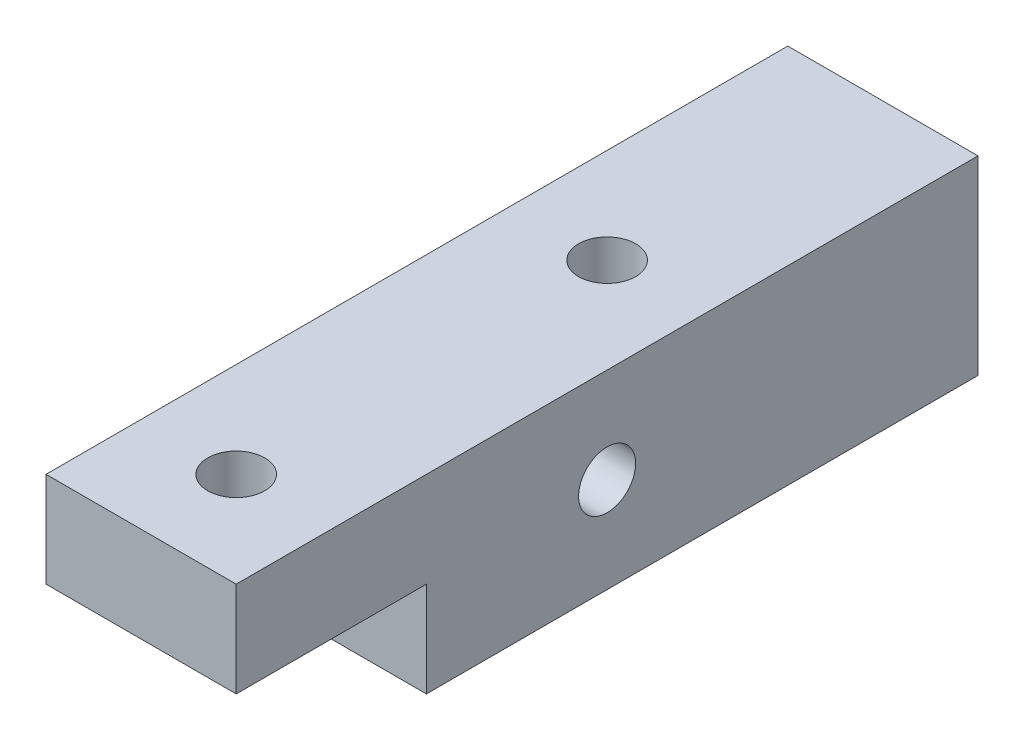
ISO-10303-21;
HEADER;
FILE_DESCRIPTION(('STEP AP214'),'2;1');
FILE_NAME('part.step','',(''),(''),'','','');
FILE_SCHEMA(('AUTOMOTIVE_DESIGN { 1 0 10303 214 1 1 1 1 }'));
ENDSEC;
DATA;
#1=APPLICATION_CONTEXT('core data for automotive mechanical design processes');
#2=APPLICATION_PROTOCOL_DEFINITION('international standard','automotive_design',2000,#1);
#3=PRODUCT_CONTEXT('',#1,'mechanical');
#4=PRODUCT('Part','Part','',(#3));
#5=PRODUCT_RELATED_PRODUCT_CATEGORY('part','',(#4));
#6=PRODUCT_DEFINITION_FORMATION('','',#4);
#7=PRODUCT_DEFINITION_CONTEXT('part definition',#1,'design');
#8=PRODUCT_DEFINITION('design','',#6,#7);
#9=PRODUCT_DEFINITION_SHAPE('','',#8);
#10=(LENGTH_UNIT() NAMED_UNIT(*) SI_UNIT(.MILLI.,.METRE.));
#11=(NAMED_UNIT(*) PLANE_ANGLE_UNIT() SI_UNIT($,.RADIAN.));
#12=(NAMED_UNIT(*) SI_UNIT($,.STERADIAN.) SOLID_ANGLE_UNIT());
#13=UNCERTAINTY_MEASURE_WITH_UNIT(LENGTH_MEASURE(1.E-05),#10,'distance_accuracy_value','');
#14=(GEOMETRIC_REPRESENTATION_CONTEXT(3) GLOBAL_UNCERTAINTY_ASSIGNED_CONTEXT((#13)) GLOBAL_UNIT_ASSIGNED_CONTEXT((#10,
#11,#12)) REPRESENTATION_CONTEXT('',''));
#15=CARTESIAN_POINT('',(0.,0.,0.));
#16=DIRECTION('',(0.,0.,1.));
#17=DIRECTION('',(1.,0.,0.));
#18=AXIS2_PLACEMENT_3D('',#15,#16,#17);
#19=CARTESIAN_POINT('',(0.,0.,39.));
#20=DIRECTION('',(1.,0.,0.));
#21=DIRECTION('',(0.,0.,-1.));
#22=AXIS2_PLACEMENT_3D('',#19,#20,#21);
#23=PLANE('',#22);
#24=CARTESIAN_POINT('',(0.,5.,19.5));
#25=DIRECTION('',(-1.,0.,0.));
#26=DIRECTION('',(0.,0.,1.));
#27=AXIS2_PLACEMENT_3D('',#24,#25,#26);
#28=CIRCLE('',#27,1.5);
#29=CARTESIAN_POINT('',(0.,5.,21.));
#30=VERTEX_POINT('',#29);
#31=EDGE_CURVE('E169',#30,#30,#28,.T.);
#32=ORIENTED_EDGE('',*,*,#31,.F.);
#33=EDGE_LOOP('',(#32));
#34=FACE_BOUND('',#33,.T.);
#35=DIRECTION('',(0.,0.,-1.));
#36=VECTOR('',#35,1.);
#37=CARTESIAN_POINT('',(0.,0.,39.));
#38=LINE('',#37,#36);
#39=CARTESIAN_POINT('',(0.,0.,29.));
#40=VERTEX_POINT('',#39);
#41=CARTESIAN_POINT('',(0.,0.,0.));
#42=VERTEX_POINT('',#41);
#43=EDGE_CURVE('E11',#40,#42,#38,.T.);
#44=ORIENTED_EDGE('',*,*,#43,.F.);
#45=DIRECTION('',(0.,-1.,0.));
#46=VECTOR('',#45,1.);
#47=CARTESIAN_POINT('',(0.,0.,29.));
#48=LINE('',#47,#46);
#49=CARTESIAN_POINT('',(0.,5.,29.));
#50=VERTEX_POINT('',#49);
#51=EDGE_CURVE('E127',#50,#40,#48,.T.);
#52=ORIENTED_EDGE('',*,*,#51,.F.);
#53=DIRECTION('',(0.,0.,-1.));
#54=VECTOR('',#53,1.);
#55=CARTESIAN_POINT('',(0.,5.,29.));
#56=LINE('',#55,#54);
#57=CARTESIAN_POINT('',(0.,5.,39.));
#58=VERTEX_POINT('',#57);
#59=EDGE_CURVE('E136',#58,#50,#56,.T.);
#60=ORIENTED_EDGE('',*,*,#59,.F.);
#61=DIRECTION('',(0.,-1.,0.));
#62=VECTOR('',#61,1.);
#63=CARTESIAN_POINT('',(0.,0.,39.));
#64=LINE('',#63,#62);
#65=CARTESIAN_POINT('',(0.,10.,39.));
#66=VERTEX_POINT('',#65);
#67=EDGE_CURVE('E87',#66,#58,#64,.T.);
#68=ORIENTED_EDGE('',*,*,#67,.F.);
#69=DIRECTION('',(0.,0.,-1.));
#70=VECTOR('',#69,1.);
#71=CARTESIAN_POINT('',(0.,10.,39.));
#72=LINE('',#71,#70);
#73=CARTESIAN_POINT('',(0.,10.,0.));
#74=VERTEX_POINT('',#73);
#75=EDGE_CURVE('E80',#66,#74,#72,.T.);
#76=ORIENTED_EDGE('',*,*,#75,.T.);
#77=DIRECTION('',(0.,-1.,0.));
#78=VECTOR('',#77,1.);
#79=CARTESIAN_POINT('',(0.,0.,0.));
#80=LINE('',#79,#78);
#81=EDGE_CURVE('E93',#74,#42,#80,.T.);
#82=ORIENTED_EDGE('',*,*,#81,.T.);
#83=EDGE_LOOP('',(#44,#52,#60,#68,#76,#82));
#84=FACE_BOUND('',#83,.T.);
#85=ADVANCED_FACE('F35',(#34,#84),#23,.F.);
#86=CARTESIAN_POINT('',(0.,0.,39.));
#87=DIRECTION('',(0.,1.,0.));
#88=DIRECTION('',(0.,0.,1.));
#89=AXIS2_PLACEMENT_3D('',#86,#87,#88);
#90=PLANE('',#89);
#91=CARTESIAN_POINT('',(5.,0.,14.5));
#92=DIRECTION('',(0.,1.,0.));
#93=DIRECTION('',(0.,0.,1.));
#94=AXIS2_PLACEMENT_3D('',#91,#92,#93);
#95=CIRCLE('',#94,1.5);
#96=CARTESIAN_POINT('',(5.,0.,16.));
#97=VERTEX_POINT('',#96);
#98=EDGE_CURVE('E172',#97,#97,#95,.T.);
#99=ORIENTED_EDGE('',*,*,#98,.T.);
#100=EDGE_LOOP('',(#99));
#101=FACE_BOUND('',#100,.T.);
#102=DIRECTION('',(0.,0.,-1.));
#103=VECTOR('',#102,1.);
#104=CARTESIAN_POINT('',(10.,0.,39.));
#105=LINE('',#104,#103);
#106=CARTESIAN_POINT('',(10.,0.,29.));
#107=VERTEX_POINT('',#106);
#108=CARTESIAN_POINT('',(10.,0.,0.));
#109=VERTEX_POINT('',#108);
#110=EDGE_CURVE('E43',#107,#109,#105,.T.);
#111=ORIENTED_EDGE('',*,*,#110,.F.);
#112=DIRECTION('',(-1.,0.,0.));
#113=VECTOR('',#112,1.);
#114=CARTESIAN_POINT('',(10.,0.,29.));
#115=LINE('',#114,#113);
#116=EDGE_CURVE('E123',#107,#40,#115,.T.);
#117=ORIENTED_EDGE('',*,*,#116,.T.);
#118=ORIENTED_EDGE('',*,*,#43,.T.);
#119=DIRECTION('',(1.,0.,0.));
#120=VECTOR('',#119,1.);
#121=CARTESIAN_POINT('',(0.,0.,0.));
#122=LINE('',#121,#120);
#123=EDGE_CURVE('E99',#42,#109,#122,.T.);
#124=ORIENTED_EDGE('',*,*,#123,.T.);
#125=EDGE_LOOP('',(#111,#117,#118,#124));
#126=FACE_BOUND('',#125,.T.);
#127=ADVANCED_FACE('F120',(#101,#126),#90,.F.);
#128=CARTESIAN_POINT('',(10.,0.,39.));
#129=DIRECTION('',(-1.,0.,0.));
#130=DIRECTION('',(0.,0.,1.));
#131=AXIS2_PLACEMENT_3D('',#128,#129,#130);
#132=PLANE('',#131);
#133=CARTESIAN_POINT('',(10.,5.,19.5));
#134=DIRECTION('',(-1.,0.,0.));
#135=DIRECTION('',(0.,0.,1.));
#136=AXIS2_PLACEMENT_3D('',#133,#134,#135);
#137=CIRCLE('',#136,1.5);
#138=CARTESIAN_POINT('',(10.,5.,21.));
#139=VERTEX_POINT('',#138);
#140=EDGE_CURVE('E171',#139,#139,#137,.T.);
#141=ORIENTED_EDGE('',*,*,#140,.T.);
#142=EDGE_LOOP('',(#141));
#143=FACE_BOUND('',#142,.T.);
#144=DIRECTION('',(0.,0.,-1.));
#145=VECTOR('',#144,1.);
#146=CARTESIAN_POINT('',(10.,5.,29.));
#147=LINE('',#146,#145);
#148=CARTESIAN_POINT('',(10.,5.,39.));
#149=VERTEX_POINT('',#148);
#150=CARTESIAN_POINT('',(10.,5.,29.));
#151=VERTEX_POINT('',#150);
#152=EDGE_CURVE('E50',#149,#151,#147,.T.);
#153=ORIENTED_EDGE('',*,*,#152,.T.);
#154=DIRECTION('',(0.,-1.,0.));
#155=VECTOR('',#154,1.);
#156=CARTESIAN_POINT('',(10.,0.,29.));
#157=LINE('',#156,#155);
#158=EDGE_CURVE('E117',#151,#107,#157,.T.);
#159=ORIENTED_EDGE('',*,*,#158,.T.);
#160=ORIENTED_EDGE('',*,*,#110,.T.);
#161=DIRECTION('',(0.,1.,0.));
#162=VECTOR('',#161,1.);
#163=CARTESIAN_POINT('',(10.,0.,0.));
#164=LINE('',#163,#162);
#165=CARTESIAN_POINT('',(10.,10.,0.));
#166=VERTEX_POINT('',#165);
#167=EDGE_CURVE('E88',#109,#166,#164,.T.);
#168=ORIENTED_EDGE('',*,*,#167,.T.);
#169=DIRECTION('',(0.,0.,-1.));
#170=VECTOR('',#169,1.);
#171=CARTESIAN_POINT('',(10.,10.,39.));
#172=LINE('',#171,#170);
#173=CARTESIAN_POINT('',(10.,10.,39.));
#174=VERTEX_POINT('',#173);
#175=EDGE_CURVE('E83',#174,#166,#172,.T.);
#176=ORIENTED_EDGE('',*,*,#175,.F.);
#177=DIRECTION('',(0.,1.,0.));
#178=VECTOR('',#177,1.);
#179=CARTESIAN_POINT('',(10.,0.,39.));
#180=LINE('',#179,#178);
#181=EDGE_CURVE('E140',#149,#174,#180,.T.);
#182=ORIENTED_EDGE('',*,*,#181,.F.);
#183=EDGE_LOOP('',(#153,#159,#160,#168,#176,#182));
#184=FACE_BOUND('',#183,.T.);
#185=ADVANCED_FACE('F114',(#143,#184),#132,.F.);
#186=CARTESIAN_POINT('',(0.,10.,39.));
#187=DIRECTION('',(0.,-1.,0.));
#188=DIRECTION('',(0.,0.,-1.));
#189=AXIS2_PLACEMENT_3D('',#186,#187,#188);
#190=PLANE('',#189);
#191=CARTESIAN_POINT('',(5.,10.,14.5));
#192=DIRECTION('',(0.,1.,0.));
#193=DIRECTION('',(0.,0.,1.));
#194=AXIS2_PLACEMENT_3D('',#191,#192,#193);
#195=CIRCLE('',#194,1.5);
#196=CARTESIAN_POINT('',(5.,10.,16.));
#197=VERTEX_POINT('',#196);
#198=EDGE_CURVE('E178',#197,#197,#195,.T.);
#199=ORIENTED_EDGE('',*,*,#198,.F.);
#200=EDGE_LOOP('',(#199));
#201=FACE_BOUND('',#200,.T.);
#202=CARTESIAN_POINT('',(5.,10.,34.));
#203=DIRECTION('',(0.,1.,0.));
#204=DIRECTION('',(0.,0.,1.));
#205=AXIS2_PLACEMENT_3D('',#202,#203,#204);
#206=CIRCLE('',#205,1.5);
#207=CARTESIAN_POINT('',(5.,10.,35.5));
#208=VERTEX_POINT('',#207);
#209=EDGE_CURVE('E175',#208,#208,#206,.T.);
#210=ORIENTED_EDGE('',*,*,#209,.F.);
#211=EDGE_LOOP('',(#210));
#212=FACE_BOUND('',#211,.T.);
#213=DIRECTION('',(-1.,0.,0.));
#214=VECTOR('',#213,1.);
#215=CARTESIAN_POINT('',(0.,10.,0.));
#216=LINE('',#215,#214);
#217=EDGE_CURVE('E77',#166,#74,#216,.T.);
#218=ORIENTED_EDGE('',*,*,#217,.T.);
#219=ORIENTED_EDGE('',*,*,#75,.F.);
#220=DIRECTION('',(-1.,0.,0.));
#221=VECTOR('',#220,1.);
#222=CARTESIAN_POINT('',(0.,10.,39.));
#223=LINE('',#222,#221);
#224=EDGE_CURVE('E59',#174,#66,#223,.T.);
#225=ORIENTED_EDGE('',*,*,#224,.F.);
#226=ORIENTED_EDGE('',*,*,#175,.T.);
#227=EDGE_LOOP('',(#218,#219,#225,#226));
#228=FACE_BOUND('',#227,.T.);
#229=ADVANCED_FACE('F79',(#201,#212,#228),#190,.F.);
#230=CARTESIAN_POINT('',(0.,0.,39.));
#231=DIRECTION('',(0.,0.,-1.));
#232=DIRECTION('',(-1.,0.,0.));
#233=AXIS2_PLACEMENT_3D('',#230,#231,#232);
#234=PLANE('',#233);
#235=ORIENTED_EDGE('',*,*,#67,.T.);
#236=DIRECTION('',(-1.,0.,0.));
#237=VECTOR('',#236,1.);
#238=CARTESIAN_POINT('',(10.,5.,39.));
#239=LINE('',#238,#237);
#240=EDGE_CURVE('E104',#149,#58,#239,.T.);
#241=ORIENTED_EDGE('',*,*,#240,.F.);
#242=ORIENTED_EDGE('',*,*,#181,.T.);
#243=ORIENTED_EDGE('',*,*,#224,.T.);
#244=EDGE_LOOP('',(#235,#241,#242,#243));
#245=FACE_BOUND('',#244,.T.);
#246=ADVANCED_FACE('F149',(#245),#234,.F.);
#247=CARTESIAN_POINT('',(0.,0.,0.));
#248=DIRECTION('',(0.,0.,-1.));
#249=DIRECTION('',(-1.,0.,0.));
#250=AXIS2_PLACEMENT_3D('',#247,#248,#249);
#251=PLANE('',#250);
#252=CARTESIAN_POINT('',(5.,5.,0.));
#253=DIRECTION('',(0.,0.,-1.));
#254=DIRECTION('',(-1.,0.,0.));
#255=AXIS2_PLACEMENT_3D('',#252,#253,#254);
#256=CIRCLE('',#255,1.5);
#257=CARTESIAN_POINT('',(3.5,5.,0.));
#258=VERTEX_POINT('',#257);
#259=EDGE_CURVE('E185',#258,#258,#256,.T.);
#260=ORIENTED_EDGE('',*,*,#259,.F.);
#261=EDGE_LOOP('',(#260));
#262=FACE_BOUND('',#261,.T.);
#263=ORIENTED_EDGE('',*,*,#81,.F.);
#264=ORIENTED_EDGE('',*,*,#217,.F.);
#265=ORIENTED_EDGE('',*,*,#167,.F.);
#266=ORIENTED_EDGE('',*,*,#123,.F.);
#267=EDGE_LOOP('',(#263,#264,#265,#266));
#268=FACE_BOUND('',#267,.T.);
#269=ADVANCED_FACE('F97',(#262,#268),#251,.T.);
#270=CARTESIAN_POINT('',(10.,0.,29.));
#271=DIRECTION('',(0.,0.,-1.));
#272=DIRECTION('',(-1.,0.,0.));
#273=AXIS2_PLACEMENT_3D('',#270,#271,#272);
#274=PLANE('',#273);
#275=ORIENTED_EDGE('',*,*,#51,.T.);
#276=ORIENTED_EDGE('',*,*,#116,.F.);
#277=ORIENTED_EDGE('',*,*,#158,.F.);
#278=DIRECTION('',(-1.,0.,0.));
#279=VECTOR('',#278,1.);
#280=CARTESIAN_POINT('',(10.,5.,29.));
#281=LINE('',#280,#279);
#282=EDGE_CURVE('E100',#151,#50,#281,.T.);
#283=ORIENTED_EDGE('',*,*,#282,.T.);
#284=EDGE_LOOP('',(#275,#276,#277,#283));
#285=FACE_BOUND('',#284,.T.);
#286=ADVANCED_FACE('F137',(#285),#274,.F.);
#287=CARTESIAN_POINT('',(10.,5.,29.));
#288=DIRECTION('',(0.,1.,0.));
#289=DIRECTION('',(0.,0.,1.));
#290=AXIS2_PLACEMENT_3D('',#287,#288,#289);
#291=PLANE('',#290);
#292=CARTESIAN_POINT('',(5.,5.,34.));
#293=DIRECTION('',(0.,1.,0.));
#294=DIRECTION('',(0.,0.,1.));
#295=AXIS2_PLACEMENT_3D('',#292,#293,#294);
#296=CIRCLE('',#295,1.5);
#297=CARTESIAN_POINT('',(5.,5.,35.5));
#298=VERTEX_POINT('',#297);
#299=EDGE_CURVE('E38',#298,#298,#296,.T.);
#300=ORIENTED_EDGE('',*,*,#299,.T.);
#301=EDGE_LOOP('',(#300));
#302=FACE_BOUND('',#301,.T.);
#303=ORIENTED_EDGE('',*,*,#59,.T.);
#304=ORIENTED_EDGE('',*,*,#282,.F.);
#305=ORIENTED_EDGE('',*,*,#152,.F.);
#306=ORIENTED_EDGE('',*,*,#240,.T.);
#307=EDGE_LOOP('',(#303,#304,#305,#306));
#308=FACE_BOUND('',#307,.T.);
#309=ADVANCED_FACE('F135',(#302,#308),#291,.F.);
#310=CARTESIAN_POINT('',(5.,5.,10.));
#311=DIRECTION('',(0.,0.,-1.));
#312=DIRECTION('',(-1.,0.,0.));
#313=AXIS2_PLACEMENT_3D('',#310,#311,#312);
#314=CYLINDRICAL_SURFACE('',#313,1.5);
#315=CARTESIAN_POINT('',(5.,5.,10.));
#316=DIRECTION('',(0.,0.,-1.));
#317=DIRECTION('',(-1.,0.,0.));
#318=AXIS2_PLACEMENT_3D('',#315,#316,#317);
#319=CIRCLE('',#318,1.5);
#320=CARTESIAN_POINT('',(3.5,5.,10.));
#321=VERTEX_POINT('',#320);
#322=EDGE_CURVE('E146',#321,#321,#319,.T.);
#323=ORIENTED_EDGE('',*,*,#322,.F.);
#324=EDGE_LOOP('',(#323));
#325=FACE_BOUND('',#324,.T.);
#326=ORIENTED_EDGE('',*,*,#259,.T.);
#327=EDGE_LOOP('',(#326));
#328=FACE_BOUND('',#327,.T.);
#329=ADVANCED_FACE('F206',(#325,#328),#314,.F.);
#330=CARTESIAN_POINT('',(5.,5.,10.));
#331=DIRECTION('',(0.,0.,-1.));
#332=DIRECTION('',(-1.,0.,0.));
#333=AXIS2_PLACEMENT_3D('',#330,#331,#332);
#334=PLANE('',#333);
#335=ORIENTED_EDGE('',*,*,#322,.T.);
#336=EDGE_LOOP('',(#335));
#337=FACE_BOUND('',#336,.T.);
#338=ADVANCED_FACE('F196',(#337),#334,.T.);
#339=CARTESIAN_POINT('',(5.,0.,34.));
#340=DIRECTION('',(0.,1.,0.));
#341=DIRECTION('',(0.,0.,1.));
#342=AXIS2_PLACEMENT_3D('',#339,#340,#341);
#343=CYLINDRICAL_SURFACE('',#342,1.5);
#344=ORIENTED_EDGE('',*,*,#209,.T.);
#345=EDGE_LOOP('',(#344));
#346=FACE_BOUND('',#345,.T.);
#347=ORIENTED_EDGE('',*,*,#299,.F.);
#348=EDGE_LOOP('',(#347));
#349=FACE_BOUND('',#348,.T.);
#350=ADVANCED_FACE('F193',(#346,#349),#343,.F.);
#351=CARTESIAN_POINT('',(10.,5.,19.5));
#352=DIRECTION('',(-1.,0.,0.));
#353=DIRECTION('',(0.,0.,1.));
#354=AXIS2_PLACEMENT_3D('',#351,#352,#353);
#355=CYLINDRICAL_SURFACE('',#354,1.5);
#356=ORIENTED_EDGE('',*,*,#140,.F.);
#357=EDGE_LOOP('',(#356));
#358=FACE_BOUND('',#357,.T.);
#359=ORIENTED_EDGE('',*,*,#31,.T.);
#360=EDGE_LOOP('',(#359));
#361=FACE_BOUND('',#360,.T.);
#362=ADVANCED_FACE('F195',(#358,#361),#355,.F.);
#363=CARTESIAN_POINT('',(5.,0.,14.5));
#364=DIRECTION('',(0.,1.,0.));
#365=DIRECTION('',(0.,0.,1.));
#366=AXIS2_PLACEMENT_3D('',#363,#364,#365);
#367=CYLINDRICAL_SURFACE('',#366,1.5);
#368=ORIENTED_EDGE('',*,*,#98,.F.);
#369=EDGE_LOOP('',(#368));
#370=FACE_BOUND('',#369,.T.);
#371=ORIENTED_EDGE('',*,*,#198,.T.);
#372=EDGE_LOOP('',(#371));
#373=FACE_BOUND('',#372,.T.);
#374=ADVANCED_FACE('F203',(#370,#373),#367,.F.);
#375=CLOSED_SHELL('',(#85,#127,#185,#229,#246,#269,#286,#309,#329,#338,#350,#362,#374));
#376=MANIFOLD_SOLID_BREP('B2',#375);
#377=ADVANCED_BREP_SHAPE_REPRESENTATION('',(#18,#376),#14);
#378=SHAPE_DEFINITION_REPRESENTATION(#9,#377);
ENDSEC;
END-ISO-10303-21;
